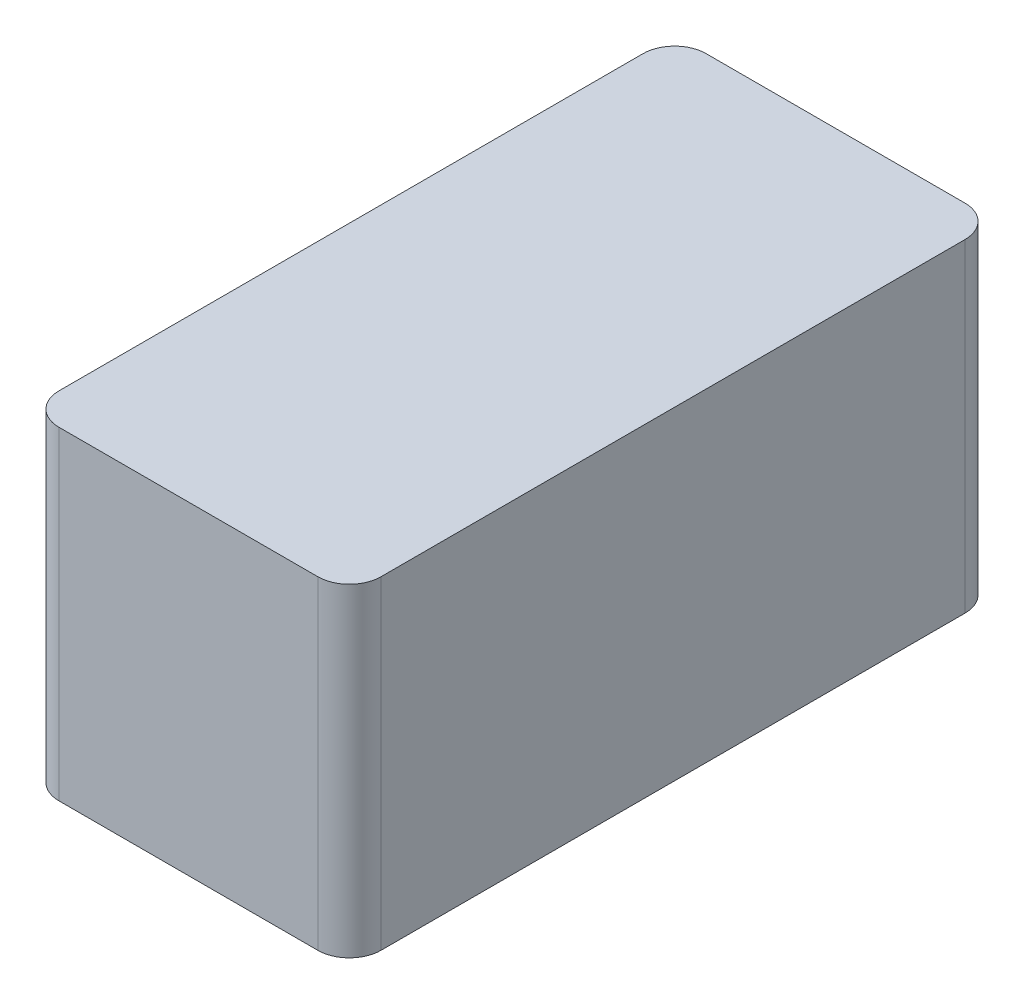
ISO-10303-21;
HEADER;
FILE_DESCRIPTION(('STEP AP214'),'2;1');
FILE_NAME('part.step','',(''),(''),'','','');
FILE_SCHEMA(('AUTOMOTIVE_DESIGN { 1 0 10303 214 1 1 1 1 }'));
ENDSEC;
DATA;
#1=APPLICATION_CONTEXT('core data for automotive mechanical design processes');
#2=APPLICATION_PROTOCOL_DEFINITION('international standard','automotive_design',2000,#1);
#3=PRODUCT_CONTEXT('',#1,'mechanical');
#4=PRODUCT('Part','Part','',(#3));
#5=PRODUCT_RELATED_PRODUCT_CATEGORY('part','',(#4));
#6=PRODUCT_DEFINITION_FORMATION('','',#4);
#7=PRODUCT_DEFINITION_CONTEXT('part definition',#1,'design');
#8=PRODUCT_DEFINITION('design','',#6,#7);
#9=PRODUCT_DEFINITION_SHAPE('','',#8);
#10=(LENGTH_UNIT() NAMED_UNIT(*) SI_UNIT(.MILLI.,.METRE.));
#11=(NAMED_UNIT(*) PLANE_ANGLE_UNIT() SI_UNIT($,.RADIAN.));
#12=(NAMED_UNIT(*) SI_UNIT($,.STERADIAN.) SOLID_ANGLE_UNIT());
#13=UNCERTAINTY_MEASURE_WITH_UNIT(LENGTH_MEASURE(1.E-05),#10,'distance_accuracy_value','');
#14=(GEOMETRIC_REPRESENTATION_CONTEXT(3) GLOBAL_UNCERTAINTY_ASSIGNED_CONTEXT((#13)) GLOBAL_UNIT_ASSIGNED_CONTEXT((#10,
#11,#12)) REPRESENTATION_CONTEXT('',''));
#15=CARTESIAN_POINT('',(0.,0.,0.));
#16=DIRECTION('',(0.,0.,1.));
#17=DIRECTION('',(1.,0.,0.));
#18=AXIS2_PLACEMENT_3D('',#15,#16,#17);
#19=CARTESIAN_POINT('',(10.2,10.25,-20.5));
#20=DIRECTION('',(-1.,0.,0.));
#21=DIRECTION('',(0.,0.,1.));
#22=AXIS2_PLACEMENT_3D('',#19,#20,#21);
#23=PLANE('',#22);
#24=DIRECTION('',(0.,0.,-1.));
#25=VECTOR('',#24,1.);
#26=CARTESIAN_POINT('',(10.2,-10.25,-20.5));
#27=LINE('',#26,#25);
#28=CARTESIAN_POINT('',(10.2,-10.25,18.5));
#29=VERTEX_POINT('',#28);
#30=CARTESIAN_POINT('',(10.2,-10.25,-18.5));
#31=VERTEX_POINT('',#30);
#32=EDGE_CURVE('E132',#29,#31,#27,.T.);
#33=ORIENTED_EDGE('',*,*,#32,.T.);
#34=DIRECTION('',(0.,-1.,0.));
#35=VECTOR('',#34,1.);
#36=CARTESIAN_POINT('',(10.2,10.25,-18.5));
#37=LINE('',#36,#35);
#38=CARTESIAN_POINT('',(10.2,10.25,-18.5));
#39=VERTEX_POINT('',#38);
#40=EDGE_CURVE('E155',#31,#39,#37,.F.);
#41=ORIENTED_EDGE('',*,*,#40,.T.);
#42=DIRECTION('',(0.,0.,-1.));
#43=VECTOR('',#42,1.);
#44=CARTESIAN_POINT('',(10.2,10.25,-20.5));
#45=LINE('',#44,#43);
#46=CARTESIAN_POINT('',(10.2,10.25,18.5));
#47=VERTEX_POINT('',#46);
#48=EDGE_CURVE('E130',#47,#39,#45,.T.);
#49=ORIENTED_EDGE('',*,*,#48,.F.);
#50=DIRECTION('',(0.,-1.,0.));
#51=VECTOR('',#50,1.);
#52=CARTESIAN_POINT('',(10.2,10.25,18.5));
#53=LINE('',#52,#51);
#54=EDGE_CURVE('E152',#47,#29,#53,.T.);
#55=ORIENTED_EDGE('',*,*,#54,.T.);
#56=EDGE_LOOP('',(#33,#41,#49,#55));
#57=FACE_BOUND('',#56,.T.);
#58=ADVANCED_FACE('F37',(#57),#23,.F.);
#59=CARTESIAN_POINT('',(-10.2,10.25,-20.5));
#60=DIRECTION('',(0.,0.,1.));
#61=DIRECTION('',(1.,0.,0.));
#62=AXIS2_PLACEMENT_3D('',#59,#60,#61);
#63=PLANE('',#62);
#64=DIRECTION('',(-1.,0.,0.));
#65=VECTOR('',#64,1.);
#66=CARTESIAN_POINT('',(-10.2,-10.25,-20.5));
#67=LINE('',#66,#65);
#68=CARTESIAN_POINT('',(8.2,-10.25,-20.5));
#69=VERTEX_POINT('',#68);
#70=CARTESIAN_POINT('',(-8.2,-10.25,-20.5));
#71=VERTEX_POINT('',#70);
#72=EDGE_CURVE('E128',#69,#71,#67,.T.);
#73=ORIENTED_EDGE('',*,*,#72,.T.);
#74=DIRECTION('',(0.,-1.,0.));
#75=VECTOR('',#74,1.);
#76=CARTESIAN_POINT('',(-8.2,10.25,-20.5));
#77=LINE('',#76,#75);
#78=CARTESIAN_POINT('',(-8.2,10.25,-20.5));
#79=VERTEX_POINT('',#78);
#80=EDGE_CURVE('E107',#71,#79,#77,.F.);
#81=ORIENTED_EDGE('',*,*,#80,.T.);
#82=DIRECTION('',(-1.,0.,0.));
#83=VECTOR('',#82,1.);
#84=CARTESIAN_POINT('',(-10.2,10.25,-20.5));
#85=LINE('',#84,#83);
#86=CARTESIAN_POINT('',(8.2,10.25,-20.5));
#87=VERTEX_POINT('',#86);
#88=EDGE_CURVE('E171',#87,#79,#85,.T.);
#89=ORIENTED_EDGE('',*,*,#88,.F.);
#90=DIRECTION('',(0.,-1.,0.));
#91=VECTOR('',#90,1.);
#92=CARTESIAN_POINT('',(8.2,10.25,-20.5));
#93=LINE('',#92,#91);
#94=EDGE_CURVE('E112',#87,#69,#93,.T.);
#95=ORIENTED_EDGE('',*,*,#94,.T.);
#96=EDGE_LOOP('',(#73,#81,#89,#95));
#97=FACE_BOUND('',#96,.T.);
#98=ADVANCED_FACE('F188',(#97),#63,.F.);
#99=CARTESIAN_POINT('',(-10.2,10.25,-20.5));
#100=DIRECTION('',(1.,0.,0.));
#101=DIRECTION('',(0.,0.,-1.));
#102=AXIS2_PLACEMENT_3D('',#99,#100,#101);
#103=PLANE('',#102);
#104=DIRECTION('',(0.,0.,1.));
#105=VECTOR('',#104,1.);
#106=CARTESIAN_POINT('',(-10.2,10.25,-20.5));
#107=LINE('',#106,#105);
#108=CARTESIAN_POINT('',(-10.2,10.25,-18.5));
#109=VERTEX_POINT('',#108);
#110=CARTESIAN_POINT('',(-10.2,10.25,18.5));
#111=VERTEX_POINT('',#110);
#112=EDGE_CURVE('E121',#109,#111,#107,.T.);
#113=ORIENTED_EDGE('',*,*,#112,.F.);
#114=DIRECTION('',(0.,-1.,0.));
#115=VECTOR('',#114,1.);
#116=CARTESIAN_POINT('',(-10.2,10.25,-18.5));
#117=LINE('',#116,#115);
#118=CARTESIAN_POINT('',(-10.2,-10.25,-18.5));
#119=VERTEX_POINT('',#118);
#120=EDGE_CURVE('E106',#109,#119,#117,.T.);
#121=ORIENTED_EDGE('',*,*,#120,.T.);
#122=DIRECTION('',(0.,0.,1.));
#123=VECTOR('',#122,1.);
#124=CARTESIAN_POINT('',(-10.2,-10.25,-20.5));
#125=LINE('',#124,#123);
#126=CARTESIAN_POINT('',(-10.2,-10.25,18.5));
#127=VERTEX_POINT('',#126);
#128=EDGE_CURVE('E119',#119,#127,#125,.T.);
#129=ORIENTED_EDGE('',*,*,#128,.T.);
#130=DIRECTION('',(0.,-1.,0.));
#131=VECTOR('',#130,1.);
#132=CARTESIAN_POINT('',(-10.2,10.25,18.5));
#133=LINE('',#132,#131);
#134=EDGE_CURVE('E123',#127,#111,#133,.F.);
#135=ORIENTED_EDGE('',*,*,#134,.T.);
#136=EDGE_LOOP('',(#113,#121,#129,#135));
#137=FACE_BOUND('',#136,.T.);
#138=ADVANCED_FACE('F118',(#137),#103,.F.);
#139=CARTESIAN_POINT('',(-10.2,10.25,20.5));
#140=DIRECTION('',(0.,0.,-1.));
#141=DIRECTION('',(-1.,0.,0.));
#142=AXIS2_PLACEMENT_3D('',#139,#140,#141);
#143=PLANE('',#142);
#144=DIRECTION('',(1.,0.,0.));
#145=VECTOR('',#144,1.);
#146=CARTESIAN_POINT('',(-10.2,-10.25,20.5));
#147=LINE('',#146,#145);
#148=CARTESIAN_POINT('',(-8.2,-10.25,20.5));
#149=VERTEX_POINT('',#148);
#150=CARTESIAN_POINT('',(8.2,-10.25,20.5));
#151=VERTEX_POINT('',#150);
#152=EDGE_CURVE('E127',#149,#151,#147,.T.);
#153=ORIENTED_EDGE('',*,*,#152,.T.);
#154=DIRECTION('',(0.,-1.,0.));
#155=VECTOR('',#154,1.);
#156=CARTESIAN_POINT('',(8.2,10.25,20.5));
#157=LINE('',#156,#155);
#158=CARTESIAN_POINT('',(8.2,10.25,20.5));
#159=VERTEX_POINT('',#158);
#160=EDGE_CURVE('E11',#151,#159,#157,.F.);
#161=ORIENTED_EDGE('',*,*,#160,.T.);
#162=DIRECTION('',(1.,0.,0.));
#163=VECTOR('',#162,1.);
#164=CARTESIAN_POINT('',(-10.2,10.25,20.5));
#165=LINE('',#164,#163);
#166=CARTESIAN_POINT('',(-8.2,10.25,20.5));
#167=VERTEX_POINT('',#166);
#168=EDGE_CURVE('E136',#167,#159,#165,.T.);
#169=ORIENTED_EDGE('',*,*,#168,.F.);
#170=DIRECTION('',(0.,-1.,0.));
#171=VECTOR('',#170,1.);
#172=CARTESIAN_POINT('',(-8.2,10.25,20.5));
#173=LINE('',#172,#171);
#174=EDGE_CURVE('E45',#167,#149,#173,.T.);
#175=ORIENTED_EDGE('',*,*,#174,.T.);
#176=EDGE_LOOP('',(#153,#161,#169,#175));
#177=FACE_BOUND('',#176,.T.);
#178=ADVANCED_FACE('F158',(#177),#143,.F.);
#179=CARTESIAN_POINT('',(0.,10.25,0.));
#180=DIRECTION('',(0.,1.,0.));
#181=DIRECTION('',(0.,0.,1.));
#182=AXIS2_PLACEMENT_3D('',#179,#180,#181);
#183=PLANE('',#182);
#184=ORIENTED_EDGE('',*,*,#88,.T.);
#185=CARTESIAN_POINT('',(-8.2,10.25,-18.5));
#186=DIRECTION('',(0.,1.,0.));
#187=DIRECTION('',(0.,0.,1.));
#188=AXIS2_PLACEMENT_3D('',#185,#186,#187);
#189=CIRCLE('',#188,2.);
#190=EDGE_CURVE('E150',#79,#109,#189,.T.);
#191=ORIENTED_EDGE('',*,*,#190,.T.);
#192=ORIENTED_EDGE('',*,*,#112,.T.);
#193=CARTESIAN_POINT('',(-8.2,10.25,18.5));
#194=DIRECTION('',(0.,1.,0.));
#195=DIRECTION('',(0.,0.,1.));
#196=AXIS2_PLACEMENT_3D('',#193,#194,#195);
#197=CIRCLE('',#196,2.);
#198=EDGE_CURVE('E57',#111,#167,#197,.T.);
#199=ORIENTED_EDGE('',*,*,#198,.T.);
#200=ORIENTED_EDGE('',*,*,#168,.T.);
#201=CARTESIAN_POINT('',(8.2,10.25,18.5));
#202=DIRECTION('',(0.,1.,0.));
#203=DIRECTION('',(0.,0.,1.));
#204=AXIS2_PLACEMENT_3D('',#201,#202,#203);
#205=CIRCLE('',#204,2.);
#206=EDGE_CURVE('E146',#159,#47,#205,.T.);
#207=ORIENTED_EDGE('',*,*,#206,.T.);
#208=ORIENTED_EDGE('',*,*,#48,.T.);
#209=CARTESIAN_POINT('',(8.2,10.25,-18.5));
#210=DIRECTION('',(0.,1.,0.));
#211=DIRECTION('',(0.,0.,1.));
#212=AXIS2_PLACEMENT_3D('',#209,#210,#211);
#213=CIRCLE('',#212,2.);
#214=EDGE_CURVE('E148',#39,#87,#213,.T.);
#215=ORIENTED_EDGE('',*,*,#214,.T.);
#216=EDGE_LOOP('',(#184,#191,#192,#199,#200,#207,#208,#215));
#217=FACE_BOUND('',#216,.T.);
#218=ADVANCED_FACE('F177',(#217),#183,.T.);
#219=CARTESIAN_POINT('',(0.,-10.25,0.));
#220=DIRECTION('',(0.,1.,0.));
#221=DIRECTION('',(0.,0.,1.));
#222=AXIS2_PLACEMENT_3D('',#219,#220,#221);
#223=PLANE('',#222);
#224=ORIENTED_EDGE('',*,*,#128,.F.);
#225=CARTESIAN_POINT('',(-8.2,-10.25,-18.5));
#226=DIRECTION('',(0.,1.,0.));
#227=DIRECTION('',(0.,0.,1.));
#228=AXIS2_PLACEMENT_3D('',#225,#226,#227);
#229=CIRCLE('',#228,2.);
#230=EDGE_CURVE('E102',#119,#71,#229,.F.);
#231=ORIENTED_EDGE('',*,*,#230,.T.);
#232=ORIENTED_EDGE('',*,*,#72,.F.);
#233=CARTESIAN_POINT('',(8.2,-10.25,-18.5));
#234=DIRECTION('',(0.,1.,0.));
#235=DIRECTION('',(0.,0.,1.));
#236=AXIS2_PLACEMENT_3D('',#233,#234,#235);
#237=CIRCLE('',#236,2.);
#238=EDGE_CURVE('E113',#69,#31,#237,.F.);
#239=ORIENTED_EDGE('',*,*,#238,.T.);
#240=ORIENTED_EDGE('',*,*,#32,.F.);
#241=CARTESIAN_POINT('',(8.2,-10.25,18.5));
#242=DIRECTION('',(0.,1.,0.));
#243=DIRECTION('',(0.,0.,1.));
#244=AXIS2_PLACEMENT_3D('',#241,#242,#243);
#245=CIRCLE('',#244,2.);
#246=EDGE_CURVE('E139',#29,#151,#245,.F.);
#247=ORIENTED_EDGE('',*,*,#246,.T.);
#248=ORIENTED_EDGE('',*,*,#152,.F.);
#249=CARTESIAN_POINT('',(-8.2,-10.25,18.5));
#250=DIRECTION('',(0.,1.,0.));
#251=DIRECTION('',(0.,0.,1.));
#252=AXIS2_PLACEMENT_3D('',#249,#250,#251);
#253=CIRCLE('',#252,2.);
#254=EDGE_CURVE('E122',#149,#127,#253,.F.);
#255=ORIENTED_EDGE('',*,*,#254,.T.);
#256=EDGE_LOOP('',(#224,#231,#232,#239,#240,#247,#248,#255));
#257=FACE_BOUND('',#256,.T.);
#258=ADVANCED_FACE('F125',(#257),#223,.F.);
#259=CARTESIAN_POINT('',(-8.2,10.25,-18.5));
#260=DIRECTION('',(0.,-1.,0.));
#261=DIRECTION('',(0.,0.,-1.));
#262=AXIS2_PLACEMENT_3D('',#259,#260,#261);
#263=CYLINDRICAL_SURFACE('',#262,2.);
#264=ORIENTED_EDGE('',*,*,#190,.F.);
#265=ORIENTED_EDGE('',*,*,#80,.F.);
#266=ORIENTED_EDGE('',*,*,#230,.F.);
#267=ORIENTED_EDGE('',*,*,#120,.F.);
#268=EDGE_LOOP('',(#264,#265,#266,#267));
#269=FACE_BOUND('',#268,.T.);
#270=ADVANCED_FACE('F105',(#269),#263,.T.);
#271=CARTESIAN_POINT('',(8.2,10.25,-18.5));
#272=DIRECTION('',(0.,-1.,0.));
#273=DIRECTION('',(0.,0.,-1.));
#274=AXIS2_PLACEMENT_3D('',#271,#272,#273);
#275=CYLINDRICAL_SURFACE('',#274,2.);
#276=ORIENTED_EDGE('',*,*,#214,.F.);
#277=ORIENTED_EDGE('',*,*,#40,.F.);
#278=ORIENTED_EDGE('',*,*,#238,.F.);
#279=ORIENTED_EDGE('',*,*,#94,.F.);
#280=EDGE_LOOP('',(#276,#277,#278,#279));
#281=FACE_BOUND('',#280,.T.);
#282=ADVANCED_FACE('F199',(#281),#275,.T.);
#283=CARTESIAN_POINT('',(8.2,10.25,18.5));
#284=DIRECTION('',(0.,-1.,0.));
#285=DIRECTION('',(0.,0.,-1.));
#286=AXIS2_PLACEMENT_3D('',#283,#284,#285);
#287=CYLINDRICAL_SURFACE('',#286,2.);
#288=ORIENTED_EDGE('',*,*,#206,.F.);
#289=ORIENTED_EDGE('',*,*,#160,.F.);
#290=ORIENTED_EDGE('',*,*,#246,.F.);
#291=ORIENTED_EDGE('',*,*,#54,.F.);
#292=EDGE_LOOP('',(#288,#289,#290,#291));
#293=FACE_BOUND('',#292,.T.);
#294=ADVANCED_FACE('F165',(#293),#287,.T.);
#295=CARTESIAN_POINT('',(-8.2,10.25,18.5));
#296=DIRECTION('',(0.,-1.,0.));
#297=DIRECTION('',(0.,0.,-1.));
#298=AXIS2_PLACEMENT_3D('',#295,#296,#297);
#299=CYLINDRICAL_SURFACE('',#298,2.);
#300=ORIENTED_EDGE('',*,*,#198,.F.);
#301=ORIENTED_EDGE('',*,*,#134,.F.);
#302=ORIENTED_EDGE('',*,*,#254,.F.);
#303=ORIENTED_EDGE('',*,*,#174,.F.);
#304=EDGE_LOOP('',(#300,#301,#302,#303));
#305=FACE_BOUND('',#304,.T.);
#306=ADVANCED_FACE('F39',(#305),#299,.T.);
#307=CLOSED_SHELL('',(#58,#98,#138,#178,#218,#258,#270,#282,#294,#306));
#308=MANIFOLD_SOLID_BREP('B2',#307);
#309=ADVANCED_BREP_SHAPE_REPRESENTATION('',(#18,#308),#14);
#310=SHAPE_DEFINITION_REPRESENTATION(#9,#309);
ENDSEC;
END-ISO-10303-21;
